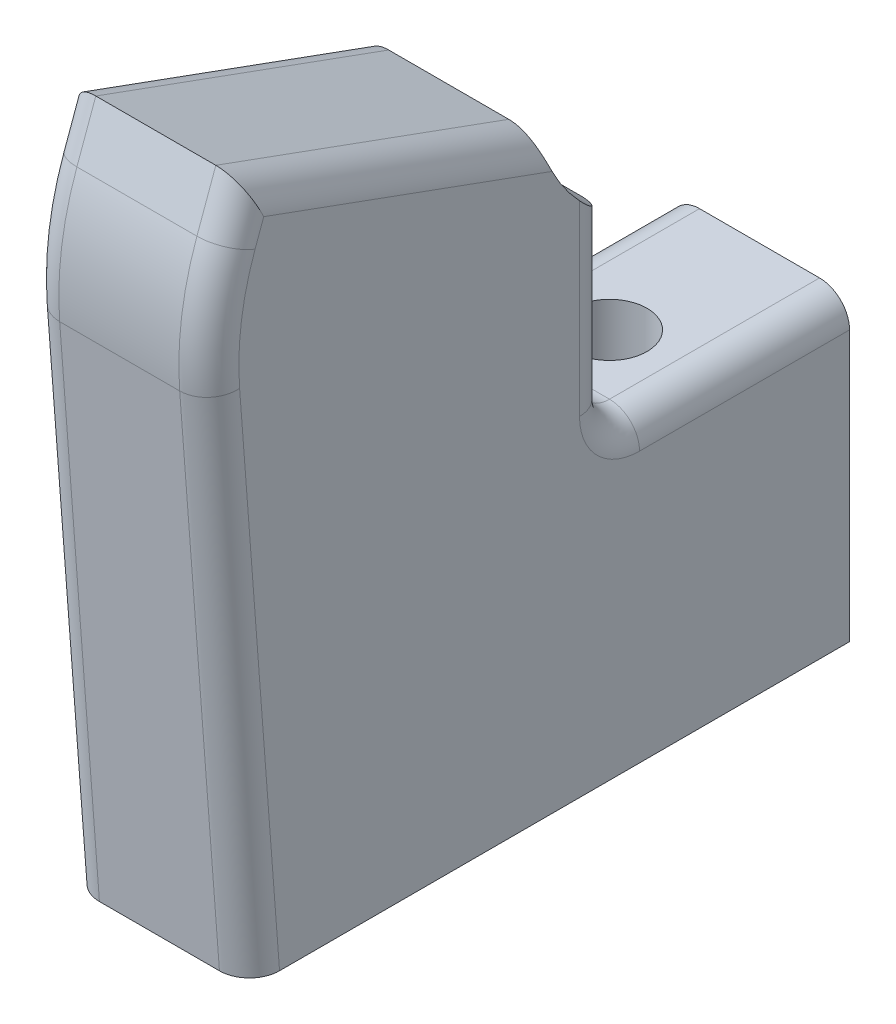
ISO-10303-21;
HEADER;
FILE_DESCRIPTION(('STEP AP214'),'2;1');
FILE_NAME('part.step','',(''),(''),'','','');
FILE_SCHEMA(('AUTOMOTIVE_DESIGN { 1 0 10303 214 1 1 1 1 }'));
ENDSEC;
DATA;
#1=APPLICATION_CONTEXT('core data for automotive mechanical design processes');
#2=APPLICATION_PROTOCOL_DEFINITION('international standard','automotive_design',2000,#1);
#3=PRODUCT_CONTEXT('',#1,'mechanical');
#4=PRODUCT('Part','Part','',(#3));
#5=PRODUCT_RELATED_PRODUCT_CATEGORY('part','',(#4));
#6=PRODUCT_DEFINITION_FORMATION('','',#4);
#7=PRODUCT_DEFINITION_CONTEXT('part definition',#1,'design');
#8=PRODUCT_DEFINITION('design','',#6,#7);
#9=PRODUCT_DEFINITION_SHAPE('','',#8);
#10=(LENGTH_UNIT() NAMED_UNIT(*) SI_UNIT(.MILLI.,.METRE.));
#11=(NAMED_UNIT(*) PLANE_ANGLE_UNIT() SI_UNIT($,.RADIAN.));
#12=(NAMED_UNIT(*) SI_UNIT($,.STERADIAN.) SOLID_ANGLE_UNIT());
#13=UNCERTAINTY_MEASURE_WITH_UNIT(LENGTH_MEASURE(1.E-05),#10,'distance_accuracy_value','');
#14=(GEOMETRIC_REPRESENTATION_CONTEXT(3) GLOBAL_UNCERTAINTY_ASSIGNED_CONTEXT((#13)) GLOBAL_UNIT_ASSIGNED_CONTEXT((#10,
#11,#12)) REPRESENTATION_CONTEXT('',''));
#15=CARTESIAN_POINT('',(0.,0.,0.));
#16=DIRECTION('',(0.,0.,1.));
#17=DIRECTION('',(1.,0.,0.));
#18=AXIS2_PLACEMENT_3D('',#15,#16,#17);
#19=CARTESIAN_POINT('',(3.,10.,0.));
#20=DIRECTION('',(0.,-1.,0.));
#21=DIRECTION('',(0.,0.,-1.));
#22=AXIS2_PLACEMENT_3D('',#19,#20,#21);
#23=PLANE('',#22);
#24=CARTESIAN_POINT('',(0.,10.,5.));
#25=DIRECTION('',(0.,1.,0.));
#26=DIRECTION('',(0.,0.,1.));
#27=AXIS2_PLACEMENT_3D('',#24,#25,#26);
#28=CIRCLE('',#27,1.25);
#29=CARTESIAN_POINT('',(0.,10.,6.25));
#30=VERTEX_POINT('',#29);
#31=EDGE_CURVE('E473',#30,#30,#28,.T.);
#32=ORIENTED_EDGE('',*,*,#31,.F.);
#33=EDGE_LOOP('',(#32));
#34=FACE_BOUND('',#33,.T.);
#35=DIRECTION('',(-1.,0.,0.));
#36=VECTOR('',#35,1.);
#37=CARTESIAN_POINT('',(3.,10.,0.));
#38=LINE('',#37,#36);
#39=CARTESIAN_POINT('',(2.,10.,0.));
#40=VERTEX_POINT('',#39);
#41=CARTESIAN_POINT('',(-2.,10.,0.));
#42=VERTEX_POINT('',#41);
#43=EDGE_CURVE('E193',#40,#42,#38,.T.);
#44=ORIENTED_EDGE('',*,*,#43,.T.);
#45=DIRECTION('',(0.,0.,1.));
#46=VECTOR('',#45,1.);
#47=CARTESIAN_POINT('',(-2.,10.,0.));
#48=LINE('',#47,#46);
#49=CARTESIAN_POINT('',(-2.,10.,7.));
#50=VERTEX_POINT('',#49);
#51=EDGE_CURVE('E256',#42,#50,#48,.T.);
#52=ORIENTED_EDGE('',*,*,#51,.T.);
#53=DIRECTION('',(-1.,0.,0.));
#54=VECTOR('',#53,1.);
#55=CARTESIAN_POINT('',(3.,10.,7.));
#56=LINE('',#55,#54);
#57=CARTESIAN_POINT('',(2.,10.,7.));
#58=VERTEX_POINT('',#57);
#59=EDGE_CURVE('E228',#50,#58,#56,.F.);
#60=ORIENTED_EDGE('',*,*,#59,.T.);
#61=DIRECTION('',(0.,0.,1.));
#62=VECTOR('',#61,1.);
#63=CARTESIAN_POINT('',(2.,10.,0.));
#64=LINE('',#63,#62);
#65=EDGE_CURVE('E254',#58,#40,#64,.F.);
#66=ORIENTED_EDGE('',*,*,#65,.T.);
#67=EDGE_LOOP('',(#44,#52,#60,#66));
#68=FACE_BOUND('',#67,.T.);
#69=ADVANCED_FACE('F37',(#34,#68),#23,.F.);
#70=CARTESIAN_POINT('',(3.,10.,8.));
#71=DIRECTION('',(0.,0.,1.));
#72=DIRECTION('',(0.,-1.,0.));
#73=AXIS2_PLACEMENT_3D('',#70,#71,#72);
#74=PLANE('',#73);
#75=DIRECTION('',(-1.,0.,0.));
#76=VECTOR('',#75,1.);
#77=CARTESIAN_POINT('',(-3.,11.,8.));
#78=LINE('',#77,#76);
#79=CARTESIAN_POINT('',(2.,11.,8.));
#80=VERTEX_POINT('',#79);
#81=CARTESIAN_POINT('',(-2.,11.,8.));
#82=VERTEX_POINT('',#81);
#83=EDGE_CURVE('E226',#80,#82,#78,.T.);
#84=ORIENTED_EDGE('',*,*,#83,.T.);
#85=DIRECTION('',(0.,1.,0.));
#86=VECTOR('',#85,1.);
#87=CARTESIAN_POINT('',(-2.,10.,8.));
#88=LINE('',#87,#86);
#89=CARTESIAN_POINT('',(-2.,16.3902277713536,8.));
#90=VERTEX_POINT('',#89);
#91=EDGE_CURVE('E11',#82,#90,#88,.T.);
#92=ORIENTED_EDGE('',*,*,#91,.T.);
#93=DIRECTION('',(-1.,0.,0.));
#94=VECTOR('',#93,1.);
#95=CARTESIAN_POINT('',(3.,16.3902277713536,8.));
#96=LINE('',#95,#94);
#97=CARTESIAN_POINT('',(2.,16.3902277713536,8.));
#98=VERTEX_POINT('',#97);
#99=EDGE_CURVE('E218',#98,#90,#96,.T.);
#100=ORIENTED_EDGE('',*,*,#99,.F.);
#101=DIRECTION('',(0.,1.,0.));
#102=VECTOR('',#101,1.);
#103=CARTESIAN_POINT('',(2.,11.,8.));
#104=LINE('',#103,#102);
#105=EDGE_CURVE('E46',#98,#80,#104,.F.);
#106=ORIENTED_EDGE('',*,*,#105,.T.);
#107=EDGE_LOOP('',(#84,#92,#100,#106));
#108=FACE_BOUND('',#107,.T.);
#109=ADVANCED_FACE('F314',(#108),#74,.F.);
#110=CARTESIAN_POINT('',(3.,21.,5.));
#111=DIRECTION('',(-1.,0.,0.));
#112=DIRECTION('',(0.,0.,1.));
#113=AXIS2_PLACEMENT_3D('',#110,#111,#112);
#114=CYLINDRICAL_SURFACE('',#113,5.5);
#115=CARTESIAN_POINT('',(-3.,21.,5.));
#116=DIRECTION('',(-1.,0.,0.));
#117=DIRECTION('',(0.,0.,-1.));
#118=AXIS2_PLACEMENT_3D('',#115,#116,#117);
#119=CIRCLE('',#118,5.5);
#120=CARTESIAN_POINT('',(-3.,17.2250827823646,9.));
#121=VERTEX_POINT('',#120);
#122=CARTESIAN_POINT('',(-3.,18.5323272446746,9.91534242679233));
#123=VERTEX_POINT('',#122);
#124=EDGE_CURVE('E204',#121,#123,#119,.T.);
#125=ORIENTED_EDGE('',*,*,#124,.T.);
#126=CARTESIAN_POINT('',(-3.,18.5323272446746,9.91534242679233));
#127=CARTESIAN_POINT('',(-2.9999940645224,18.569878927195,9.9341953725239));
#128=CARTESIAN_POINT('',(-2.99875149983137,18.6076385253118,9.95261155643784));
#129=CARTESIAN_POINT('',(-2.99357620269175,18.6834664896391,9.98853063301829));
#130=CARTESIAN_POINT('',(-2.98963986993021,18.7215352016216,10.0060322696235));
#131=CARTESIAN_POINT('',(-2.97338488414524,18.8364834549103,10.0572952080955));
#132=CARTESIAN_POINT('',(-2.95661328105314,18.9135165484355,10.0895193787493));
#133=CARTESIAN_POINT('',(-2.91384613200539,19.051255481967,10.1436205490458));
#134=CARTESIAN_POINT('',(-2.89012694237485,19.1123486221734,10.1663093177545));
#135=CARTESIAN_POINT('',(-2.83286759283885,19.2309005158198,10.2080905826313));
#136=CARTESIAN_POINT('',(-2.79936239673772,19.2883713374391,10.2271954909937));
#137=CARTESIAN_POINT('',(-2.7285944436658,19.3881108228266,10.2587148771826));
#138=CARTESIAN_POINT('',(-2.69291056698211,19.4313108557483,10.2717141654576));
#139=CARTESIAN_POINT('',(-2.61456475083595,19.5118088957251,10.2950016510268));
#140=CARTESIAN_POINT('',(-2.57190087254907,19.5491052572468,10.3052890929765));
#141=CARTESIAN_POINT('',(-2.47997397302768,19.6161307593423,10.323168617895));
#142=CARTESIAN_POINT('',(-2.43066656244867,19.6458047163279,10.3307411939545));
#143=CARTESIAN_POINT('',(-2.32707446456003,19.6954200636488,10.3431013337664));
#144=CARTESIAN_POINT('',(-2.27279739346084,19.715376060108,10.347893079207));
#145=CARTESIAN_POINT('',(-2.18169298340834,19.7389790398331,10.3534956426059));
#146=CARTESIAN_POINT('',(-2.14573964599937,19.7459211175687,10.3551213803981));
#147=CARTESIAN_POINT('',(-2.07320106091841,19.7552188376778,10.3572872406983));
#148=CARTESIAN_POINT('',(-2.03661559365209,19.7575728525273,10.3578269779715));
#149=CARTESIAN_POINT('',(-2.,19.7575570959827,10.3578293767399));
#150=B_SPLINE_CURVE_WITH_KNOTS('',3,(#126,#127,#128,#129,#130,#131,#132,#133,#134,#135,#136,
#137,#138,#139,#140,#141,#142,#143,#144,#145,#146,#147,#148,#149),.UNSPECIFIED.,.F.,.F.,(4,2,2,
2,2,2,2,2,2,2,2,4),(0.,0.126007131396446,0.252183005389079,0.506493287174717,0.71382345347059,
0.92042173977914,1.09228456201345,1.26419520362553,1.43731741077469,1.61017860539829,
1.71985132593381,1.8295629436084),.UNSPECIFIED.);
#151=CARTESIAN_POINT('',(-2.,19.7575570959827,10.3578293767399));
#152=VERTEX_POINT('',#151);
#153=EDGE_CURVE('E327',#123,#152,#150,.T.);
#154=ORIENTED_EDGE('',*,*,#153,.T.);
#155=DIRECTION('',(-1.,0.,0.));
#156=VECTOR('',#155,1.);
#157=CARTESIAN_POINT('',(3.,19.7575570959827,10.3578293767399));
#158=LINE('',#157,#156);
#159=CARTESIAN_POINT('',(2.,19.7575570959827,10.3578293767399));
#160=VERTEX_POINT('',#159);
#161=EDGE_CURVE('E215',#160,#152,#158,.T.);
#162=ORIENTED_EDGE('',*,*,#161,.F.);
#163=CARTESIAN_POINT('',(2.,19.7575570959827,10.3578293767399));
#164=CARTESIAN_POINT('',(2.02454305414716,19.7575585789982,10.3578286535342));
#165=CARTESIAN_POINT('',(2.0490733933995,19.7565061077195,10.3575857670363));
#166=CARTESIAN_POINT('',(2.09793916494014,19.7523188246767,10.3566126063858));
#167=CARTESIAN_POINT('',(2.12227464991099,19.7491845964158,10.3558824688063));
#168=CARTESIAN_POINT('',(2.1945173793877,19.7367377265474,10.3529659979378));
#169=CARTESIAN_POINT('',(2.24190583903538,19.7243803169343,10.3500536372073));
#170=CARTESIAN_POINT('',(2.33380501142737,19.6921542086829,10.3422663237887));
#171=CARTESIAN_POINT('',(2.37831746229944,19.6722900974243,10.3373925695992));
#172=CARTESIAN_POINT('',(2.46349837127777,19.6259572678452,10.3256526191592));
#173=CARTESIAN_POINT('',(2.50416386221451,19.5994835078435,10.3187849013066));
#174=CARTESIAN_POINT('',(2.58251978266189,19.5397835750448,10.3027125718223));
#175=CARTESIAN_POINT('',(2.62000721481963,19.5063160820205,10.2934202047623));
#176=CARTESIAN_POINT('',(2.68948396469557,19.4347293969038,10.2726953178964));
#177=CARTESIAN_POINT('',(2.72147434643112,19.3966111074748,10.2612632131584));
#178=CARTESIAN_POINT('',(2.78392204472678,19.3113942473527,10.2345837691862));
#179=CARTESIAN_POINT('',(2.81354556650726,19.2637843081871,10.2190268332506));
#180=CARTESIAN_POINT('',(2.86579090452588,19.1655771625991,10.185325165982));
#181=CARTESIAN_POINT('',(2.88839183784633,19.1149715693453,10.1671729464408));
#182=CARTESIAN_POINT('',(2.9240085354496,19.020001774664,10.1314501028289));
#183=CARTESIAN_POINT('',(2.93795854662124,18.9758563035993,10.1142095092154));
#184=CARTESIAN_POINT('',(2.96143069920425,18.8869851009994,10.0781365779695));
#185=CARTESIAN_POINT('',(2.97094746357205,18.8422587320994,10.0593023399521));
#186=CARTESIAN_POINT('',(2.98583461342092,18.7530682658031,10.0203234413953));
#187=CARTESIAN_POINT('',(2.99123225749661,18.7086044110175,10.0001883692505));
#188=CARTESIAN_POINT('',(2.99830758823332,18.6200958262535,9.95867494195405));
#189=CARTESIAN_POINT('',(2.99999469285722,18.5760503183469,9.9372998761366));
#190=CARTESIAN_POINT('',(3.,18.5323272446746,9.91534242679233));
#191=B_SPLINE_CURVE_WITH_KNOTS('',3,(#163,#164,#165,#166,#167,#168,#169,#170,#171,#172,#173,
#174,#175,#176,#177,#178,#179,#180,#181,#182,#183,#184,#185,#186,#187,#188,#189,#190),
.UNSPECIFIED.,.F.,.F.,(4,2,2,2,2,2,2,2,2,2,2,2,2,4),(0.,0.0735805692071807,0.147140522948295,
0.293535642456805,0.43984144353111,0.586259185943219,0.738970158618834,0.891651538951055,
1.0655938593586,1.24004858458828,1.38801999612738,1.53617041649168,1.68333172856334,
1.83011908772161),.UNSPECIFIED.);
#192=CARTESIAN_POINT('',(3.,18.5323272446746,9.91534242679233));
#193=VERTEX_POINT('',#192);
#194=EDGE_CURVE('E292',#160,#193,#191,.T.);
#195=ORIENTED_EDGE('',*,*,#194,.T.);
#196=CARTESIAN_POINT('',(3.,21.,5.));
#197=DIRECTION('',(-1.,0.,0.));
#198=DIRECTION('',(0.,0.,-1.));
#199=AXIS2_PLACEMENT_3D('',#196,#197,#198);
#200=CIRCLE('',#199,5.5);
#201=CARTESIAN_POINT('',(3.,17.2250827823646,9.));
#202=VERTEX_POINT('',#201);
#203=EDGE_CURVE('E181',#202,#193,#200,.T.);
#204=ORIENTED_EDGE('',*,*,#203,.F.);
#205=CARTESIAN_POINT('',(3.,17.2250827823646,9.));
#206=CARTESIAN_POINT('',(2.9999940645224,17.1945233765428,8.97116104823867));
#207=CARTESIAN_POINT('',(2.99875149983137,17.164303281256,8.94197733838624));
#208=CARTESIAN_POINT('',(2.99357620269175,17.1046156988206,8.88300740757881));
#209=CARTESIAN_POINT('',(2.98963986993021,17.0751492737225,8.85322043210626));
#210=CARTESIAN_POINT('',(2.97338488414524,16.9876632506558,8.76273736428214));
#211=CARTESIAN_POINT('',(2.95661328105314,16.9310355655931,8.70137125020567));
#212=CARTESIAN_POINT('',(2.9138461320054,16.8330876053017,8.59044268079014));
#213=CARTESIAN_POINT('',(2.89012694237485,16.7908720522018,8.54079392368314));
#214=CARTESIAN_POINT('',(2.83286759283885,16.7110633702535,8.44368161824496));
#215=CARTESIAN_POINT('',(2.79936239673772,16.6734544501973,8.39621097475518));
#216=CARTESIAN_POINT('',(2.72859444366581,16.6097230024964,8.31326678131741));
#217=CARTESIAN_POINT('',(2.69291056698211,16.5827323857773,8.27711804760206));
#218=CARTESIAN_POINT('',(2.61456475083595,16.533317356261,8.20943942260023));
#219=CARTESIAN_POINT('',(2.57190087254907,16.510894216061,8.17791081926619));
#220=CARTESIAN_POINT('',(2.47997397302768,16.4711688865987,8.12104260721781));
#221=CARTESIAN_POINT('',(2.43066656244867,16.453903901734,8.09574818235812));
#222=CARTESIAN_POINT('',(2.32707446456003,16.4253197213591,8.05335242339298));
#223=CARTESIAN_POINT('',(2.27279739346083,16.4139916007586,8.03623879424223));
#224=CARTESIAN_POINT('',(2.18169298340834,16.4006542187667,8.01597543790261));
#225=CARTESIAN_POINT('',(2.14573964599937,16.3967521945379,8.01000805375427));
#226=CARTESIAN_POINT('',(2.07320106091841,16.3915369440318,8.00201182262795));
#227=CARTESIAN_POINT('',(2.03661559365209,16.3902246364028,7.99998437326417));
#228=CARTESIAN_POINT('',(2.,16.3902277713536,8.));
#229=B_SPLINE_CURVE_WITH_KNOTS('',3,(#205,#206,#207,#208,#209,#210,#211,#212,#213,#214,#215,
#216,#217,#218,#219,#220,#221,#222,#223,#224,#225,#226,#227,#228),.UNSPECIFIED.,.F.,.F.,(4,2,2,
2,2,2,2,2,2,2,2,4),(0.,0.12600713139645,0.252183005389082,0.506493287174717,0.713823453470589,
0.920421739779144,1.09228456201345,1.26419520362554,1.4373174107747,1.61017860539829,
1.71985132593381,1.82956294360841),.UNSPECIFIED.);
#230=EDGE_CURVE('E59',#202,#98,#229,.T.);
#231=ORIENTED_EDGE('',*,*,#230,.T.);
#232=ORIENTED_EDGE('',*,*,#99,.T.);
#233=CARTESIAN_POINT('',(-2.,16.3902277713536,8.));
#234=CARTESIAN_POINT('',(-2.02454305414716,16.3902279437234,7.99999835907036));
#235=CARTESIAN_POINT('',(-2.0490733933995,16.3908161487507,8.00090428648965));
#236=CARTESIAN_POINT('',(-2.09793916494014,16.3931627557793,8.00450620492094));
#237=CARTESIAN_POINT('',(-2.12227464991099,16.394920829874,8.00720169433003));
#238=CARTESIAN_POINT('',(-2.1945173793877,16.4019184962442,8.01790043431281));
#239=CARTESIAN_POINT('',(-2.24190583903538,16.4088817031388,8.02851651490382));
#240=CARTESIAN_POINT('',(-2.33380501142738,16.4272213622569,8.05613573297273));
#241=CARTESIAN_POINT('',(-2.37831746229944,16.438595119284,8.07313496963451));
#242=CARTESIAN_POINT('',(-2.46349837127777,16.4654738250942,8.11265828815793));
#243=CARTESIAN_POINT('',(-2.50416386221451,16.4809819280721,8.13518658723174));
#244=CARTESIAN_POINT('',(-2.58251978266189,16.5165035570596,8.18578911311034));
#245=CARTESIAN_POINT('',(-2.62000721481963,16.5366820825765,8.21406009262778));
#246=CARTESIAN_POINT('',(-2.68948396469557,16.5806411941348,8.27424124360212));
#247=CARTESIAN_POINT('',(-2.72147434643112,16.604421081411,8.30615070879454));
#248=CARTESIAN_POINT('',(-2.78392204472678,16.658637440751,8.37710345616659));
#249=CARTESIAN_POINT('',(-2.81354556650727,16.6895397368689,8.41652137921818));
#250=CARTESIAN_POINT('',(-2.86579090452588,16.754797766919,8.49727926016615));
#251=CARTESIAN_POINT('',(-2.88839183784633,16.7891634059305,8.53862453798815));
#252=CARTESIAN_POINT('',(-2.9240085354496,16.8552134812546,8.61564902115554));
#253=CARTESIAN_POINT('',(-2.93795854662124,16.8865129801919,8.65123556425743));
#254=CARTESIAN_POINT('',(-2.96143069920425,16.9508061889445,8.72240950842605));
#255=CARTESIAN_POINT('',(-2.97094746357205,16.9838019025292,8.75799685844974));
#256=CARTESIAN_POINT('',(-2.98583461342092,17.0509350219354,8.82847691300173));
#257=CARTESIAN_POINT('',(-2.99123225749661,17.0850633346354,8.8633726689747));
#258=CARTESIAN_POINT('',(-2.99830758823332,17.154344914776,8.93234510459975));
#259=CARTESIAN_POINT('',(-2.99999469285722,17.1894953573205,8.96642364028386));
#260=CARTESIAN_POINT('',(-3.,17.2250827823646,9.));
#261=B_SPLINE_CURVE_WITH_KNOTS('',3,(#233,#234,#235,#236,#237,#238,#239,#240,#241,#242,#243,
#244,#245,#246,#247,#248,#249,#250,#251,#252,#253,#254,#255,#256,#257,#258,#259,#260),
.UNSPECIFIED.,.F.,.F.,(4,2,2,2,2,2,2,2,2,2,2,2,2,4),(0.,0.073580569207181,0.147140522948297,
0.293535642456806,0.439841443531111,0.586259185943221,0.738970158618837,0.891651538951054,
1.06559385935861,1.24004858458828,1.38801999612738,1.53617041649167,1.68333172856334,
1.8301190877216),.UNSPECIFIED.);
#262=EDGE_CURVE('E321',#90,#121,#261,.T.);
#263=ORIENTED_EDGE('',*,*,#262,.T.);
#264=EDGE_LOOP('',(#125,#154,#162,#195,#204,#231,#232,#263));
#265=FACE_BOUND('',#264,.T.);
#266=ADVANCED_FACE('F308',(#265),#114,.F.);
#267=CARTESIAN_POINT('',(3.,23.3112242875274,20.1214497417656));
#268=DIRECTION('',(0.,-0.939692620785906,0.342020143325676));
#269=DIRECTION('',(0.,-0.342020143325676,-0.939692620785906));
#270=AXIS2_PLACEMENT_3D('',#267,#268,#269);
#271=PLANE('',#270);
#272=ORIENTED_EDGE('',*,*,#161,.T.);
#273=DIRECTION('',(0.,0.342020143325676,0.939692620785906));
#274=VECTOR('',#273,1.);
#275=CARTESIAN_POINT('',(-2.,23.3112242875274,20.1214497417656));
#276=LINE('',#275,#274);
#277=CARTESIAN_POINT('',(-2.,23.3112242875274,20.1214497417656));
#278=VERTEX_POINT('',#277);
#279=EDGE_CURVE('E290',#152,#278,#276,.T.);
#280=ORIENTED_EDGE('',*,*,#279,.T.);
#281=DIRECTION('',(-1.,0.,0.));
#282=VECTOR('',#281,1.);
#283=CARTESIAN_POINT('',(3.,23.3112242875274,20.1214497417656));
#284=LINE('',#283,#282);
#285=CARTESIAN_POINT('',(2.,23.3112242875274,20.1214497417656));
#286=VERTEX_POINT('',#285);
#287=EDGE_CURVE('E212',#286,#278,#284,.T.);
#288=ORIENTED_EDGE('',*,*,#287,.F.);
#289=DIRECTION('',(0.,0.342020143325676,0.939692620785906));
#290=VECTOR('',#289,1.);
#291=CARTESIAN_POINT('',(2.,19.7575570959827,10.3578293767399));
#292=LINE('',#291,#290);
#293=EDGE_CURVE('E288',#286,#160,#292,.F.);
#294=ORIENTED_EDGE('',*,*,#293,.T.);
#295=EDGE_LOOP('',(#272,#280,#288,#294));
#296=FACE_BOUND('',#295,.T.);
#297=ADVANCED_FACE('F313',(#296),#271,.F.);
#298=CARTESIAN_POINT('',(3.,19.5524538043838,21.4895303150683));
#299=DIRECTION('',(0.,-0.342020143325676,-0.939692620785906));
#300=DIRECTION('',(0.,0.939692620785906,-0.342020143325676));
#301=AXIS2_PLACEMENT_3D('',#298,#299,#300);
#302=PLANE('',#301);
#303=ORIENTED_EDGE('',*,*,#287,.T.);
#304=DIRECTION('',(0.,-0.939692620785906,0.342020143325676));
#305=VECTOR('',#304,1.);
#306=CARTESIAN_POINT('',(-2.,19.5524538043838,21.4895303150683));
#307=LINE('',#306,#305);
#308=CARTESIAN_POINT('',(-2.,21.5804032088678,20.7514170952382));
#309=VERTEX_POINT('',#308);
#310=EDGE_CURVE('E233',#278,#309,#307,.T.);
#311=ORIENTED_EDGE('',*,*,#310,.T.);
#312=DIRECTION('',(-1.,0.,0.));
#313=VECTOR('',#312,1.);
#314=CARTESIAN_POINT('',(3.,21.5804032088678,20.7514170952382));
#315=LINE('',#314,#313);
#316=CARTESIAN_POINT('',(2.,21.5804032088678,20.7514170952382));
#317=VERTEX_POINT('',#316);
#318=EDGE_CURVE('E223',#309,#317,#315,.F.);
#319=ORIENTED_EDGE('',*,*,#318,.T.);
#320=DIRECTION('',(0.,-0.939692620785906,0.342020143325676));
#321=VECTOR('',#320,1.);
#322=CARTESIAN_POINT('',(2.,23.3112242875274,20.1214497417656));
#323=LINE('',#322,#321);
#324=EDGE_CURVE('E231',#317,#286,#323,.F.);
#325=ORIENTED_EDGE('',*,*,#324,.T.);
#326=EDGE_LOOP('',(#303,#311,#319,#325));
#327=FACE_BOUND('',#326,.T.);
#328=ADVANCED_FACE('F466',(#327),#302,.F.);
#329=CARTESIAN_POINT('',(3.,0.,20.));
#330=DIRECTION('',(0.,0.0759611426306253,-0.99711077860499));
#331=DIRECTION('',(0.,0.99711077860499,0.0759611426306253));
#332=AXIS2_PLACEMENT_3D('',#329,#330,#331);
#333=PLANE('',#332);
#334=DIRECTION('',(-1.,0.,0.));
#335=VECTOR('',#334,1.);
#336=CARTESIAN_POINT('',(3.,17.4005903493048,21.3255986734291));
#337=LINE('',#336,#335);
#338=CARTESIAN_POINT('',(2.,17.4005903493048,21.3255986734291));
#339=VERTEX_POINT('',#338);
#340=CARTESIAN_POINT('',(-2.,17.4005903493048,21.3255986734291));
#341=VERTEX_POINT('',#340);
#342=EDGE_CURVE('E220',#339,#341,#337,.T.);
#343=ORIENTED_EDGE('',*,*,#342,.T.);
#344=DIRECTION('',(0.,-0.99711077860499,-0.0759611426306253));
#345=VECTOR('',#344,1.);
#346=CARTESIAN_POINT('',(-2.,0.,20.));
#347=LINE('',#346,#345);
#348=CARTESIAN_POINT('',(-2.,0.,20.));
#349=VERTEX_POINT('',#348);
#350=EDGE_CURVE('E282',#341,#349,#347,.T.);
#351=ORIENTED_EDGE('',*,*,#350,.T.);
#352=DIRECTION('',(-1.,0.,0.));
#353=VECTOR('',#352,1.);
#354=CARTESIAN_POINT('',(3.,0.,20.));
#355=LINE('',#354,#353);
#356=CARTESIAN_POINT('',(2.,0.,20.));
#357=VERTEX_POINT('',#356);
#358=EDGE_CURVE('E192',#357,#349,#355,.T.);
#359=ORIENTED_EDGE('',*,*,#358,.F.);
#360=DIRECTION('',(0.,-0.99711077860499,-0.0759611426306253));
#361=VECTOR('',#360,1.);
#362=CARTESIAN_POINT('',(2.,17.4005903493048,21.3255986734291));
#363=LINE('',#362,#361);
#364=EDGE_CURVE('E280',#357,#339,#363,.F.);
#365=ORIENTED_EDGE('',*,*,#364,.T.);
#366=EDGE_LOOP('',(#343,#351,#359,#365));
#367=FACE_BOUND('',#366,.T.);
#368=ADVANCED_FACE('F494',(#367),#333,.F.);
#369=CARTESIAN_POINT('',(3.,0.,0.));
#370=DIRECTION('',(0.,1.,0.));
#371=DIRECTION('',(0.,0.,1.));
#372=AXIS2_PLACEMENT_3D('',#369,#370,#371);
#373=PLANE('',#372);
#374=CARTESIAN_POINT('',(0.,0.,5.));
#375=DIRECTION('',(0.,1.,0.));
#376=DIRECTION('',(0.,0.,1.));
#377=AXIS2_PLACEMENT_3D('',#374,#375,#376);
#378=CIRCLE('',#377,1.25);
#379=CARTESIAN_POINT('',(0.,0.,6.25));
#380=VERTEX_POINT('',#379);
#381=EDGE_CURVE('E426',#380,#380,#378,.T.);
#382=ORIENTED_EDGE('',*,*,#381,.T.);
#383=EDGE_LOOP('',(#382));
#384=FACE_BOUND('',#383,.T.);
#385=ORIENTED_EDGE('',*,*,#358,.T.);
#386=CARTESIAN_POINT('',(-2.,0.,18.9971024068168));
#387=DIRECTION('',(0.,1.,0.));
#388=DIRECTION('',(0.,0.,-1.));
#389=AXIS2_PLACEMENT_3D('',#386,#387,#388);
#390=ELLIPSE('',#389,1.00289759318323,1.);
#391=CARTESIAN_POINT('',(-3.,0.,18.9971024068168));
#392=VERTEX_POINT('',#391);
#393=EDGE_CURVE('E286',#349,#392,#390,.F.);
#394=ORIENTED_EDGE('',*,*,#393,.T.);
#395=DIRECTION('',(0.,0.,-1.));
#396=VECTOR('',#395,1.);
#397=CARTESIAN_POINT('',(-3.,0.,0.));
#398=LINE('',#397,#396);
#399=CARTESIAN_POINT('',(-3.,0.,0.));
#400=VERTEX_POINT('',#399);
#401=EDGE_CURVE('E188',#392,#400,#398,.T.);
#402=ORIENTED_EDGE('',*,*,#401,.T.);
#403=DIRECTION('',(-1.,0.,0.));
#404=VECTOR('',#403,1.);
#405=CARTESIAN_POINT('',(3.,0.,0.));
#406=LINE('',#405,#404);
#407=CARTESIAN_POINT('',(3.,0.,0.));
#408=VERTEX_POINT('',#407);
#409=EDGE_CURVE('E184',#408,#400,#406,.T.);
#410=ORIENTED_EDGE('',*,*,#409,.F.);
#411=DIRECTION('',(0.,0.,-1.));
#412=VECTOR('',#411,1.);
#413=CARTESIAN_POINT('',(3.,0.,0.));
#414=LINE('',#413,#412);
#415=CARTESIAN_POINT('',(3.,0.,18.9971024068168));
#416=VERTEX_POINT('',#415);
#417=EDGE_CURVE('E170',#416,#408,#414,.T.);
#418=ORIENTED_EDGE('',*,*,#417,.F.);
#419=CARTESIAN_POINT('',(2.,0.,18.9971024068168));
#420=DIRECTION('',(0.,1.,0.));
#421=DIRECTION('',(0.,0.,1.));
#422=AXIS2_PLACEMENT_3D('',#419,#420,#421);
#423=ELLIPSE('',#422,1.00289759318323,1.);
#424=EDGE_CURVE('E284',#416,#357,#423,.F.);
#425=ORIENTED_EDGE('',*,*,#424,.T.);
#426=EDGE_LOOP('',(#385,#394,#402,#410,#418,#425));
#427=FACE_BOUND('',#426,.T.);
#428=ADVANCED_FACE('F186',(#384,#427),#373,.F.);
#429=CARTESIAN_POINT('',(3.,0.,0.));
#430=DIRECTION('',(0.,0.,1.));
#431=DIRECTION('',(1.,0.,0.));
#432=AXIS2_PLACEMENT_3D('',#429,#430,#431);
#433=PLANE('',#432);
#434=DIRECTION('',(0.,1.,0.));
#435=VECTOR('',#434,1.);
#436=CARTESIAN_POINT('',(-3.,0.,0.));
#437=LINE('',#436,#435);
#438=CARTESIAN_POINT('',(-3.,9.,0.));
#439=VERTEX_POINT('',#438);
#440=EDGE_CURVE('E209',#400,#439,#437,.T.);
#441=ORIENTED_EDGE('',*,*,#440,.T.);
#442=CARTESIAN_POINT('',(-2.,9.,0.));
#443=DIRECTION('',(0.,0.,1.));
#444=DIRECTION('',(1.,0.,0.));
#445=AXIS2_PLACEMENT_3D('',#442,#443,#444);
#446=CIRCLE('',#445,1.);
#447=EDGE_CURVE('E260',#439,#42,#446,.F.);
#448=ORIENTED_EDGE('',*,*,#447,.T.);
#449=ORIENTED_EDGE('',*,*,#43,.F.);
#450=CARTESIAN_POINT('',(2.,9.,0.));
#451=DIRECTION('',(0.,0.,1.));
#452=DIRECTION('',(1.,0.,0.));
#453=AXIS2_PLACEMENT_3D('',#450,#451,#452);
#454=CIRCLE('',#453,1.);
#455=CARTESIAN_POINT('',(3.,9.,0.));
#456=VERTEX_POINT('',#455);
#457=EDGE_CURVE('E198',#40,#456,#454,.F.);
#458=ORIENTED_EDGE('',*,*,#457,.T.);
#459=DIRECTION('',(0.,1.,0.));
#460=VECTOR('',#459,1.);
#461=CARTESIAN_POINT('',(3.,0.,0.));
#462=LINE('',#461,#460);
#463=EDGE_CURVE('E175',#408,#456,#462,.T.);
#464=ORIENTED_EDGE('',*,*,#463,.F.);
#465=ORIENTED_EDGE('',*,*,#409,.T.);
#466=EDGE_LOOP('',(#441,#448,#449,#458,#464,#465));
#467=FACE_BOUND('',#466,.T.);
#468=ADVANCED_FACE('F195',(#467),#433,.F.);
#469=CARTESIAN_POINT('',(3.,21.,5.));
#470=DIRECTION('',(1.,0.,0.));
#471=DIRECTION('',(0.,0.,-1.));
#472=AXIS2_PLACEMENT_3D('',#469,#470,#471);
#473=PLANE('',#472);
#474=ORIENTED_EDGE('',*,*,#463,.T.);
#475=DIRECTION('',(0.,0.,1.));
#476=VECTOR('',#475,1.);
#477=CARTESIAN_POINT('',(3.,9.,7.));
#478=LINE('',#477,#476);
#479=CARTESIAN_POINT('',(3.,9.,7.));
#480=VERTEX_POINT('',#479);
#481=EDGE_CURVE('E278',#456,#480,#478,.T.);
#482=ORIENTED_EDGE('',*,*,#481,.T.);
#483=CARTESIAN_POINT('',(3.,11.,7.));
#484=DIRECTION('',(1.,0.,0.));
#485=DIRECTION('',(0.,0.,-1.));
#486=AXIS2_PLACEMENT_3D('',#483,#484,#485);
#487=CIRCLE('',#486,2.);
#488=CARTESIAN_POINT('',(3.,11.,9.));
#489=VERTEX_POINT('',#488);
#490=EDGE_CURVE('E276',#480,#489,#487,.F.);
#491=ORIENTED_EDGE('',*,*,#490,.T.);
#492=DIRECTION('',(0.,1.,0.));
#493=VECTOR('',#492,1.);
#494=CARTESIAN_POINT('',(3.,16.3902277713536,9.));
#495=LINE('',#494,#493);
#496=EDGE_CURVE('E274',#489,#202,#495,.T.);
#497=ORIENTED_EDGE('',*,*,#496,.T.);
#498=ORIENTED_EDGE('',*,*,#203,.T.);
#499=DIRECTION('',(0.,0.342020143325676,0.939692620785906));
#500=VECTOR('',#499,1.);
#501=CARTESIAN_POINT('',(3.,22.3715316667415,20.4634698850913));
#502=LINE('',#501,#500);
#503=CARTESIAN_POINT('',(3.,22.0295115234158,19.5237772643054));
#504=VERTEX_POINT('',#503);
#505=EDGE_CURVE('E272',#193,#504,#502,.T.);
#506=ORIENTED_EDGE('',*,*,#505,.T.);
#507=DIRECTION('',(0.,-0.939692620785906,0.342020143325676));
#508=VECTOR('',#507,1.);
#509=CARTESIAN_POINT('',(3.,21.2383830655421,19.8117244744523));
#510=LINE('',#509,#508);
#511=CARTESIAN_POINT('',(3.,21.2383830655421,19.8117244744523));
#512=VERTEX_POINT('',#511);
#513=EDGE_CURVE('E269',#504,#512,#510,.T.);
#514=ORIENTED_EDGE('',*,*,#513,.T.);
#515=CARTESIAN_POINT('',(3.,18.1602017756111,11.3544908873792));
#516=DIRECTION('',(1.,0.,0.));
#517=DIRECTION('',(0.,0.,-1.));
#518=AXIS2_PLACEMENT_3D('',#515,#516,#517);
#519=CIRCLE('',#518,9.);
#520=CARTESIAN_POINT('',(3.,17.4765514919354,20.3284878948241));
#521=VERTEX_POINT('',#520);
#522=EDGE_CURVE('E267',#512,#521,#519,.T.);
#523=ORIENTED_EDGE('',*,*,#522,.T.);
#524=DIRECTION('',(0.,-0.99711077860499,-0.0759611426306253));
#525=VECTOR('',#524,1.);
#526=CARTESIAN_POINT('',(3.,0.0759611426306255,19.002889221395));
#527=LINE('',#526,#525);
#528=EDGE_CURVE('E178',#521,#416,#527,.T.);
#529=ORIENTED_EDGE('',*,*,#528,.T.);
#530=ORIENTED_EDGE('',*,*,#417,.T.);
#531=EDGE_LOOP('',(#474,#482,#491,#497,#498,#506,#514,#523,#529,#530));
#532=FACE_BOUND('',#531,.T.);
#533=ADVANCED_FACE('F172',(#532),#473,.T.);
#534=CARTESIAN_POINT('',(-3.,21.,5.));
#535=DIRECTION('',(1.,0.,0.));
#536=DIRECTION('',(0.,0.,-1.));
#537=AXIS2_PLACEMENT_3D('',#534,#535,#536);
#538=PLANE('',#537);
#539=ORIENTED_EDGE('',*,*,#401,.F.);
#540=DIRECTION('',(0.,-0.99711077860499,-0.0759611426306253));
#541=VECTOR('',#540,1.);
#542=CARTESIAN_POINT('',(-3.,19.8186640325637,20.5069129490639));
#543=LINE('',#542,#541);
#544=CARTESIAN_POINT('',(-3.,17.4765514919354,20.3284878948241));
#545=VERTEX_POINT('',#544);
#546=EDGE_CURVE('E248',#392,#545,#543,.F.);
#547=ORIENTED_EDGE('',*,*,#546,.T.);
#548=CARTESIAN_POINT('',(-3.,18.1602017756111,11.3544908873792));
#549=DIRECTION('',(1.,0.,0.));
#550=DIRECTION('',(0.,0.,-1.));
#551=AXIS2_PLACEMENT_3D('',#548,#549,#550);
#552=CIRCLE('',#551,9.);
#553=CARTESIAN_POINT('',(-3.,21.2383830655421,19.8117244744523));
#554=VERTEX_POINT('',#553);
#555=EDGE_CURVE('E246',#545,#554,#552,.F.);
#556=ORIENTED_EDGE('',*,*,#555,.T.);
#557=DIRECTION('',(0.,-0.939692620785906,0.342020143325676));
#558=VECTOR('',#557,1.);
#559=CARTESIAN_POINT('',(-3.,25.7882820065595,18.1556966910027));
#560=LINE('',#559,#558);
#561=CARTESIAN_POINT('',(-3.,22.0295115234158,19.5237772643054));
#562=VERTEX_POINT('',#561);
#563=EDGE_CURVE('E244',#554,#562,#560,.F.);
#564=ORIENTED_EDGE('',*,*,#563,.T.);
#565=DIRECTION('',(0.,0.342020143325676,0.939692620785906));
#566=VECTOR('',#565,1.);
#567=CARTESIAN_POINT('',(-3.,17.2412295168564,6.36808057330271));
#568=LINE('',#567,#566);
#569=EDGE_CURVE('E242',#562,#123,#568,.F.);
#570=ORIENTED_EDGE('',*,*,#569,.T.);
#571=ORIENTED_EDGE('',*,*,#124,.F.);
#572=DIRECTION('',(0.,1.,0.));
#573=VECTOR('',#572,1.);
#574=CARTESIAN_POINT('',(-3.,21.,9.));
#575=LINE('',#574,#573);
#576=CARTESIAN_POINT('',(-3.,11.,9.));
#577=VERTEX_POINT('',#576);
#578=EDGE_CURVE('E236',#121,#577,#575,.F.);
#579=ORIENTED_EDGE('',*,*,#578,.T.);
#580=CARTESIAN_POINT('',(-3.,11.,7.));
#581=DIRECTION('',(1.,0.,0.));
#582=DIRECTION('',(0.,0.,-1.));
#583=AXIS2_PLACEMENT_3D('',#580,#581,#582);
#584=CIRCLE('',#583,2.);
#585=CARTESIAN_POINT('',(-3.,9.,7.));
#586=VERTEX_POINT('',#585);
#587=EDGE_CURVE('E238',#577,#586,#584,.T.);
#588=ORIENTED_EDGE('',*,*,#587,.T.);
#589=DIRECTION('',(0.,0.,1.));
#590=VECTOR('',#589,1.);
#591=CARTESIAN_POINT('',(-3.,9.,5.));
#592=LINE('',#591,#590);
#593=EDGE_CURVE('E240',#586,#439,#592,.F.);
#594=ORIENTED_EDGE('',*,*,#593,.T.);
#595=ORIENTED_EDGE('',*,*,#440,.F.);
#596=EDGE_LOOP('',(#539,#547,#556,#564,#570,#571,#579,#588,#594,#595));
#597=FACE_BOUND('',#596,.T.);
#598=ADVANCED_FACE('F380',(#597),#538,.F.);
#599=CARTESIAN_POINT('',(3.,18.1602017756111,11.3544908873792));
#600=DIRECTION('',(-1.,0.,0.));
#601=DIRECTION('',(0.,0.,1.));
#602=AXIS2_PLACEMENT_3D('',#599,#600,#601);
#603=CYLINDRICAL_SURFACE('',#602,10.);
#604=ORIENTED_EDGE('',*,*,#318,.F.);
#605=CARTESIAN_POINT('',(-2.,18.1602017756111,11.3544908873792));
#606=DIRECTION('',(1.,0.,0.));
#607=DIRECTION('',(0.,0.,-1.));
#608=AXIS2_PLACEMENT_3D('',#605,#606,#607);
#609=CIRCLE('',#608,10.);
#610=EDGE_CURVE('E252',#309,#341,#609,.T.);
#611=ORIENTED_EDGE('',*,*,#610,.T.);
#612=ORIENTED_EDGE('',*,*,#342,.F.);
#613=CARTESIAN_POINT('',(2.,18.1602017756111,11.3544908873792));
#614=DIRECTION('',(1.,0.,0.));
#615=DIRECTION('',(0.,0.,-1.));
#616=AXIS2_PLACEMENT_3D('',#613,#614,#615);
#617=CIRCLE('',#616,10.);
#618=EDGE_CURVE('E250',#339,#317,#617,.F.);
#619=ORIENTED_EDGE('',*,*,#618,.T.);
#620=EDGE_LOOP('',(#604,#611,#612,#619));
#621=FACE_BOUND('',#620,.T.);
#622=ADVANCED_FACE('F376',(#621),#603,.T.);
#623=CARTESIAN_POINT('',(3.,11.,7.));
#624=DIRECTION('',(1.,0.,0.));
#625=DIRECTION('',(0.,0.,-1.));
#626=AXIS2_PLACEMENT_3D('',#623,#624,#625);
#627=CYLINDRICAL_SURFACE('',#626,1.);
#628=ORIENTED_EDGE('',*,*,#59,.F.);
#629=CARTESIAN_POINT('',(-2.,11.,7.));
#630=DIRECTION('',(1.,0.,0.));
#631=DIRECTION('',(0.,0.,-1.));
#632=AXIS2_PLACEMENT_3D('',#629,#630,#631);
#633=CIRCLE('',#632,1.);
#634=EDGE_CURVE('E264',#50,#82,#633,.F.);
#635=ORIENTED_EDGE('',*,*,#634,.T.);
#636=ORIENTED_EDGE('',*,*,#83,.F.);
#637=CARTESIAN_POINT('',(2.,11.,7.));
#638=DIRECTION('',(1.,0.,0.));
#639=DIRECTION('',(0.,0.,-1.));
#640=AXIS2_PLACEMENT_3D('',#637,#638,#639);
#641=CIRCLE('',#640,1.);
#642=EDGE_CURVE('E262',#80,#58,#641,.T.);
#643=ORIENTED_EDGE('',*,*,#642,.T.);
#644=EDGE_LOOP('',(#628,#635,#636,#643));
#645=FACE_BOUND('',#644,.T.);
#646=ADVANCED_FACE('F379',(#645),#627,.F.);
#647=CARTESIAN_POINT('',(-2.,0.0759611426306228,19.002889221395));
#648=DIRECTION('',(0.,-0.99711077860499,-0.0759611426306253));
#649=DIRECTION('',(0.,0.0759611426306253,-0.99711077860499));
#650=AXIS2_PLACEMENT_3D('',#647,#648,#649);
#651=CYLINDRICAL_SURFACE('',#650,1.);
#652=ORIENTED_EDGE('',*,*,#393,.F.);
#653=ORIENTED_EDGE('',*,*,#350,.F.);
#654=CARTESIAN_POINT('',(-2.,17.4765514919354,20.3284878948241));
#655=DIRECTION('',(0.,0.99711077860499,0.0759611426306256));
#656=DIRECTION('',(0.,-0.0759611426306256,0.99711077860499));
#657=AXIS2_PLACEMENT_3D('',#654,#655,#656);
#658=CIRCLE('',#657,1.);
#659=EDGE_CURVE('E207',#545,#341,#658,.T.);
#660=ORIENTED_EDGE('',*,*,#659,.F.);
#661=ORIENTED_EDGE('',*,*,#546,.F.);
#662=EDGE_LOOP('',(#652,#653,#660,#661));
#663=FACE_BOUND('',#662,.T.);
#664=ADVANCED_FACE('F384',(#663),#651,.T.);
#665=CARTESIAN_POINT('',(-2.,22.3715316667415,20.4634698850913));
#666=DIRECTION('',(0.,0.342020143325676,0.939692620785906));
#667=DIRECTION('',(0.,-0.939692620785906,0.342020143325676));
#668=AXIS2_PLACEMENT_3D('',#665,#666,#667);
#669=CYLINDRICAL_SURFACE('',#668,1.);
#670=ORIENTED_EDGE('',*,*,#153,.F.);
#671=ORIENTED_EDGE('',*,*,#569,.F.);
#672=CARTESIAN_POINT('',(-2.,22.0295115234158,19.5237772643054));
#673=DIRECTION('',(0.,-0.422618261740692,0.906307787036653));
#674=DIRECTION('',(0.,0.906307787036653,0.422618261740692));
#675=AXIS2_PLACEMENT_3D('',#672,#673,#674);
#676=ELLIPSE('',#675,1.4142135623731,1.);
#677=EDGE_CURVE('E448',#278,#562,#676,.T.);
#678=ORIENTED_EDGE('',*,*,#677,.F.);
#679=ORIENTED_EDGE('',*,*,#279,.F.);
#680=EDGE_LOOP('',(#670,#671,#678,#679));
#681=FACE_BOUND('',#680,.T.);
#682=ADVANCED_FACE('F391',(#681),#669,.T.);
#683=CARTESIAN_POINT('',(-2.,18.1602017756111,11.3544908873792));
#684=DIRECTION('',(1.,0.,0.));
#685=DIRECTION('',(0.,0.,-1.));
#686=AXIS2_PLACEMENT_3D('',#683,#684,#685);
#687=TOROIDAL_SURFACE('',#686,9.,1.);
#688=ORIENTED_EDGE('',*,*,#659,.T.);
#689=ORIENTED_EDGE('',*,*,#610,.F.);
#690=CARTESIAN_POINT('',(-2.,21.2383830655421,19.8117244744523));
#691=DIRECTION('',(0.,0.939692620785905,-0.342020143325677));
#692=DIRECTION('',(0.,0.342020143325677,0.939692620785906));
#693=AXIS2_PLACEMENT_3D('',#690,#691,#692);
#694=CIRCLE('',#693,1.);
#695=EDGE_CURVE('E446',#554,#309,#694,.T.);
#696=ORIENTED_EDGE('',*,*,#695,.F.);
#697=ORIENTED_EDGE('',*,*,#555,.F.);
#698=EDGE_LOOP('',(#688,#689,#696,#697));
#699=FACE_BOUND('',#698,.T.);
#700=ADVANCED_FACE('F388',(#699),#687,.T.);
#701=CARTESIAN_POINT('',(-2.,19.2104336610581,20.5498376942824));
#702=DIRECTION('',(0.,-0.939692620785906,0.342020143325676));
#703=DIRECTION('',(0.,-0.342020143325676,-0.939692620785906));
#704=AXIS2_PLACEMENT_3D('',#701,#702,#703);
#705=CYLINDRICAL_SURFACE('',#704,1.);
#706=ORIENTED_EDGE('',*,*,#677,.T.);
#707=ORIENTED_EDGE('',*,*,#563,.F.);
#708=ORIENTED_EDGE('',*,*,#695,.T.);
#709=ORIENTED_EDGE('',*,*,#310,.F.);
#710=EDGE_LOOP('',(#706,#707,#708,#709));
#711=FACE_BOUND('',#710,.T.);
#712=ADVANCED_FACE('F340',(#711),#705,.T.);
#713=CARTESIAN_POINT('',(-2.,10.,9.));
#714=DIRECTION('',(0.,1.,0.));
#715=DIRECTION('',(0.,0.,1.));
#716=AXIS2_PLACEMENT_3D('',#713,#714,#715);
#717=CYLINDRICAL_SURFACE('',#716,1.);
#718=ORIENTED_EDGE('',*,*,#262,.F.);
#719=ORIENTED_EDGE('',*,*,#91,.F.);
#720=CARTESIAN_POINT('',(-2.,11.,9.));
#721=DIRECTION('',(0.,-1.,0.));
#722=DIRECTION('',(0.,0.,-1.));
#723=AXIS2_PLACEMENT_3D('',#720,#721,#722);
#724=CIRCLE('',#723,1.);
#725=EDGE_CURVE('E422',#577,#82,#724,.T.);
#726=ORIENTED_EDGE('',*,*,#725,.F.);
#727=ORIENTED_EDGE('',*,*,#578,.F.);
#728=EDGE_LOOP('',(#718,#719,#726,#727));
#729=FACE_BOUND('',#728,.T.);
#730=ADVANCED_FACE('F334',(#729),#717,.T.);
#731=CARTESIAN_POINT('',(-2.,11.,7.));
#732=DIRECTION('',(1.,0.,0.));
#733=DIRECTION('',(0.,0.,-1.));
#734=AXIS2_PLACEMENT_3D('',#731,#732,#733);
#735=TOROIDAL_SURFACE('',#734,2.,1.);
#736=ORIENTED_EDGE('',*,*,#725,.T.);
#737=ORIENTED_EDGE('',*,*,#634,.F.);
#738=CARTESIAN_POINT('',(-2.,9.,7.));
#739=DIRECTION('',(0.,0.,-1.));
#740=DIRECTION('',(-1.,0.,0.));
#741=AXIS2_PLACEMENT_3D('',#738,#739,#740);
#742=CIRCLE('',#741,1.);
#743=EDGE_CURVE('E418',#586,#50,#742,.T.);
#744=ORIENTED_EDGE('',*,*,#743,.F.);
#745=ORIENTED_EDGE('',*,*,#587,.F.);
#746=EDGE_LOOP('',(#736,#737,#744,#745));
#747=FACE_BOUND('',#746,.T.);
#748=ADVANCED_FACE('F339',(#747),#735,.T.);
#749=CARTESIAN_POINT('',(-2.,9.,0.));
#750=DIRECTION('',(0.,0.,1.));
#751=DIRECTION('',(0.,-1.,0.));
#752=AXIS2_PLACEMENT_3D('',#749,#750,#751);
#753=CYLINDRICAL_SURFACE('',#752,1.);
#754=ORIENTED_EDGE('',*,*,#447,.F.);
#755=ORIENTED_EDGE('',*,*,#593,.F.);
#756=ORIENTED_EDGE('',*,*,#743,.T.);
#757=ORIENTED_EDGE('',*,*,#51,.F.);
#758=EDGE_LOOP('',(#754,#755,#756,#757));
#759=FACE_BOUND('',#758,.T.);
#760=ADVANCED_FACE('F354',(#759),#753,.T.);
#761=CARTESIAN_POINT('',(2.,21.,9.));
#762=DIRECTION('',(0.,-1.,0.));
#763=DIRECTION('',(0.,0.,-1.));
#764=AXIS2_PLACEMENT_3D('',#761,#762,#763);
#765=CYLINDRICAL_SURFACE('',#764,1.);
#766=ORIENTED_EDGE('',*,*,#230,.F.);
#767=ORIENTED_EDGE('',*,*,#496,.F.);
#768=CARTESIAN_POINT('',(2.,11.,9.));
#769=DIRECTION('',(0.,-1.,0.));
#770=DIRECTION('',(0.,0.,-1.));
#771=AXIS2_PLACEMENT_3D('',#768,#769,#770);
#772=CIRCLE('',#771,1.);
#773=EDGE_CURVE('E416',#80,#489,#772,.T.);
#774=ORIENTED_EDGE('',*,*,#773,.F.);
#775=ORIENTED_EDGE('',*,*,#105,.F.);
#776=EDGE_LOOP('',(#766,#767,#774,#775));
#777=FACE_BOUND('',#776,.T.);
#778=ADVANCED_FACE('F349',(#777),#765,.T.);
#779=CARTESIAN_POINT('',(2.,11.,7.));
#780=DIRECTION('',(1.,0.,0.));
#781=DIRECTION('',(0.,0.,-1.));
#782=AXIS2_PLACEMENT_3D('',#779,#780,#781);
#783=TOROIDAL_SURFACE('',#782,2.,1.);
#784=ORIENTED_EDGE('',*,*,#773,.T.);
#785=ORIENTED_EDGE('',*,*,#490,.F.);
#786=CARTESIAN_POINT('',(2.,9.,7.));
#787=DIRECTION('',(0.,0.,-1.));
#788=DIRECTION('',(-1.,0.,0.));
#789=AXIS2_PLACEMENT_3D('',#786,#787,#788);
#790=CIRCLE('',#789,1.);
#791=EDGE_CURVE('E412',#58,#480,#790,.T.);
#792=ORIENTED_EDGE('',*,*,#791,.F.);
#793=ORIENTED_EDGE('',*,*,#642,.F.);
#794=EDGE_LOOP('',(#784,#785,#792,#793));
#795=FACE_BOUND('',#794,.T.);
#796=ADVANCED_FACE('F346',(#795),#783,.T.);
#797=CARTESIAN_POINT('',(2.,9.,5.));
#798=DIRECTION('',(0.,0.,-1.));
#799=DIRECTION('',(0.,1.,0.));
#800=AXIS2_PLACEMENT_3D('',#797,#798,#799);
#801=CYLINDRICAL_SURFACE('',#800,1.);
#802=ORIENTED_EDGE('',*,*,#457,.F.);
#803=ORIENTED_EDGE('',*,*,#65,.F.);
#804=ORIENTED_EDGE('',*,*,#791,.T.);
#805=ORIENTED_EDGE('',*,*,#481,.F.);
#806=EDGE_LOOP('',(#802,#803,#804,#805));
#807=FACE_BOUND('',#806,.T.);
#808=ADVANCED_FACE('F343',(#807),#801,.T.);
#809=CARTESIAN_POINT('',(2.,19.8186640325637,20.5069129490638));
#810=DIRECTION('',(0.,0.99711077860499,0.0759611426306253));
#811=DIRECTION('',(0.,-0.0759611426306253,0.99711077860499));
#812=AXIS2_PLACEMENT_3D('',#809,#810,#811);
#813=CYLINDRICAL_SURFACE('',#812,1.);
#814=ORIENTED_EDGE('',*,*,#424,.F.);
#815=ORIENTED_EDGE('',*,*,#528,.F.);
#816=CARTESIAN_POINT('',(2.,17.4765514919354,20.3284878948241));
#817=DIRECTION('',(0.,0.99711077860499,0.0759611426306256));
#818=DIRECTION('',(0.,-0.0759611426306256,0.99711077860499));
#819=AXIS2_PLACEMENT_3D('',#816,#817,#818);
#820=CIRCLE('',#819,1.);
#821=EDGE_CURVE('E41',#339,#521,#820,.T.);
#822=ORIENTED_EDGE('',*,*,#821,.F.);
#823=ORIENTED_EDGE('',*,*,#364,.F.);
#824=EDGE_LOOP('',(#814,#815,#822,#823));
#825=FACE_BOUND('',#824,.T.);
#826=ADVANCED_FACE('F39',(#825),#813,.T.);
#827=CARTESIAN_POINT('',(2.,17.2412295168564,6.36808057330271));
#828=DIRECTION('',(0.,-0.342020143325676,-0.939692620785906));
#829=DIRECTION('',(0.,0.939692620785906,-0.342020143325676));
#830=AXIS2_PLACEMENT_3D('',#827,#828,#829);
#831=CYLINDRICAL_SURFACE('',#830,1.);
#832=ORIENTED_EDGE('',*,*,#194,.F.);
#833=ORIENTED_EDGE('',*,*,#293,.F.);
#834=CARTESIAN_POINT('',(2.,22.0295115234158,19.5237772643054));
#835=DIRECTION('',(0.,0.422618261740692,-0.906307787036653));
#836=DIRECTION('',(0.,-0.906307787036653,-0.422618261740692));
#837=AXIS2_PLACEMENT_3D('',#834,#835,#836);
#838=ELLIPSE('',#837,1.4142135623731,1.);
#839=EDGE_CURVE('E420',#504,#286,#838,.F.);
#840=ORIENTED_EDGE('',*,*,#839,.F.);
#841=ORIENTED_EDGE('',*,*,#505,.F.);
#842=EDGE_LOOP('',(#832,#833,#840,#841));
#843=FACE_BOUND('',#842,.T.);
#844=ADVANCED_FACE('F305',(#843),#831,.T.);
#845=CARTESIAN_POINT('',(2.,18.1602017756111,11.3544908873792));
#846=DIRECTION('',(1.,0.,0.));
#847=DIRECTION('',(0.,0.,-1.));
#848=AXIS2_PLACEMENT_3D('',#845,#846,#847);
#849=TOROIDAL_SURFACE('',#848,9.,1.);
#850=ORIENTED_EDGE('',*,*,#821,.T.);
#851=ORIENTED_EDGE('',*,*,#522,.F.);
#852=CARTESIAN_POINT('',(2.,21.2383830655421,19.8117244744523));
#853=DIRECTION('',(0.,0.939692620785905,-0.342020143325677));
#854=DIRECTION('',(0.,0.342020143325677,0.939692620785906));
#855=AXIS2_PLACEMENT_3D('',#852,#853,#854);
#856=CIRCLE('',#855,1.);
#857=EDGE_CURVE('E425',#317,#512,#856,.T.);
#858=ORIENTED_EDGE('',*,*,#857,.F.);
#859=ORIENTED_EDGE('',*,*,#618,.F.);
#860=EDGE_LOOP('',(#850,#851,#858,#859));
#861=FACE_BOUND('',#860,.T.);
#862=ADVANCED_FACE('F359',(#861),#849,.T.);
#863=CARTESIAN_POINT('',(2.,25.7882820065595,18.1556966910027));
#864=DIRECTION('',(0.,0.939692620785906,-0.342020143325676));
#865=DIRECTION('',(0.,0.342020143325676,0.939692620785906));
#866=AXIS2_PLACEMENT_3D('',#863,#864,#865);
#867=CYLINDRICAL_SURFACE('',#866,1.);
#868=ORIENTED_EDGE('',*,*,#839,.T.);
#869=ORIENTED_EDGE('',*,*,#324,.F.);
#870=ORIENTED_EDGE('',*,*,#857,.T.);
#871=ORIENTED_EDGE('',*,*,#513,.F.);
#872=EDGE_LOOP('',(#868,#869,#870,#871));
#873=FACE_BOUND('',#872,.T.);
#874=ADVANCED_FACE('F356',(#873),#867,.T.);
#875=CARTESIAN_POINT('',(0.,0.,5.));
#876=DIRECTION('',(0.,1.,0.));
#877=DIRECTION('',(0.,0.,1.));
#878=AXIS2_PLACEMENT_3D('',#875,#876,#877);
#879=CYLINDRICAL_SURFACE('',#878,1.25);
#880=ORIENTED_EDGE('',*,*,#381,.F.);
#881=EDGE_LOOP('',(#880));
#882=FACE_BOUND('',#881,.T.);
#883=ORIENTED_EDGE('',*,*,#31,.T.);
#884=EDGE_LOOP('',(#883));
#885=FACE_BOUND('',#884,.T.);
#886=ADVANCED_FACE('F358',(#882,#885),#879,.F.);
#887=CLOSED_SHELL('',(#69,#109,#266,#297,#328,#368,#428,#468,#533,#598,#622,#646,#664,#682,#700,
#712,#730,#748,#760,#778,#796,#808,#826,#844,#862,#874,#886));
#888=MANIFOLD_SOLID_BREP('B2',#887);
#889=ADVANCED_BREP_SHAPE_REPRESENTATION('',(#18,#888),#14);
#890=SHAPE_DEFINITION_REPRESENTATION(#9,#889);
ENDSEC;
END-ISO-10303-21;
